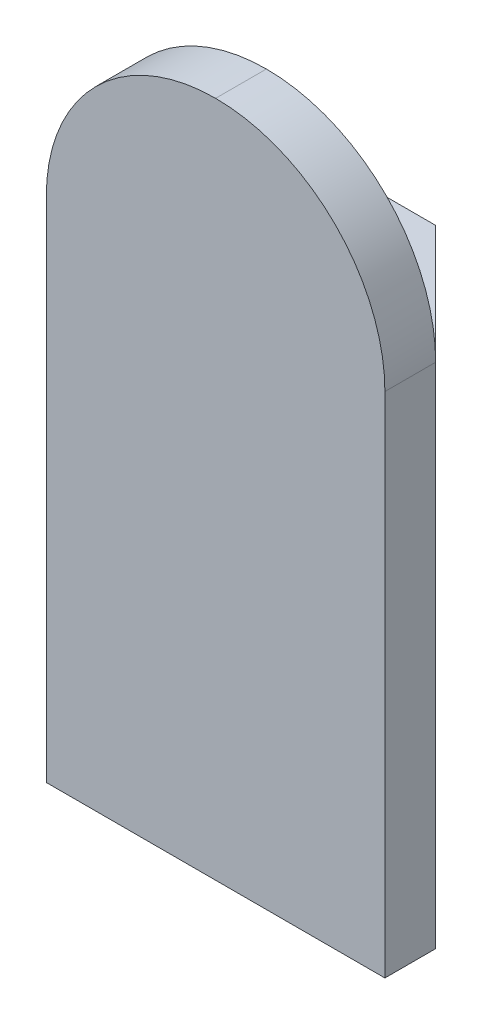
ISO-10303-21;
HEADER;
FILE_DESCRIPTION(('STEP AP214'),'2;1');
FILE_NAME('part.step','',(''),(''),'','','');
FILE_SCHEMA(('AUTOMOTIVE_DESIGN { 1 0 10303 214 1 1 1 1 }'));
ENDSEC;
DATA;
#1=APPLICATION_CONTEXT('core data for automotive mechanical design processes');
#2=APPLICATION_PROTOCOL_DEFINITION('international standard','automotive_design',2000,#1);
#3=PRODUCT_CONTEXT('',#1,'mechanical');
#4=PRODUCT('Part','Part','',(#3));
#5=PRODUCT_RELATED_PRODUCT_CATEGORY('part','',(#4));
#6=PRODUCT_DEFINITION_FORMATION('','',#4);
#7=PRODUCT_DEFINITION_CONTEXT('part definition',#1,'design');
#8=PRODUCT_DEFINITION('design','',#6,#7);
#9=PRODUCT_DEFINITION_SHAPE('','',#8);
#10=(LENGTH_UNIT() NAMED_UNIT(*) SI_UNIT(.MILLI.,.METRE.));
#11=(NAMED_UNIT(*) PLANE_ANGLE_UNIT() SI_UNIT($,.RADIAN.));
#12=(NAMED_UNIT(*) SI_UNIT($,.STERADIAN.) SOLID_ANGLE_UNIT());
#13=UNCERTAINTY_MEASURE_WITH_UNIT(LENGTH_MEASURE(1.E-05),#10,'distance_accuracy_value','');
#14=(GEOMETRIC_REPRESENTATION_CONTEXT(3) GLOBAL_UNCERTAINTY_ASSIGNED_CONTEXT((#13)) GLOBAL_UNIT_ASSIGNED_CONTEXT((#10,
#11,#12)) REPRESENTATION_CONTEXT('',''));
#15=CARTESIAN_POINT('',(0.,0.,0.));
#16=DIRECTION('',(0.,0.,1.));
#17=DIRECTION('',(1.,0.,0.));
#18=AXIS2_PLACEMENT_3D('',#15,#16,#17);
#19=CARTESIAN_POINT('',(0.,10.,0.));
#20=DIRECTION('',(0.,0.,1.));
#21=DIRECTION('',(1.,0.,0.));
#22=AXIS2_PLACEMENT_3D('',#19,#20,#21);
#23=PLANE('',#22);
#24=CARTESIAN_POINT('',(10.,20.,0.));
#25=DIRECTION('',(0.,0.,1.));
#26=DIRECTION('',(1.,0.,0.));
#27=AXIS2_PLACEMENT_3D('',#24,#25,#26);
#28=CIRCLE('',#27,10.);
#29=CARTESIAN_POINT('',(20.,20.,0.));
#30=VERTEX_POINT('',#29);
#31=CARTESIAN_POINT('',(10.,30.,0.));
#32=VERTEX_POINT('',#31);
#33=EDGE_CURVE('E194',#30,#32,#28,.T.);
#34=ORIENTED_EDGE('',*,*,#33,.T.);
#35=CARTESIAN_POINT('',(10.,20.,0.));
#36=DIRECTION('',(0.,0.,1.));
#37=DIRECTION('',(1.,0.,0.));
#38=AXIS2_PLACEMENT_3D('',#35,#36,#37);
#39=CIRCLE('',#38,10.);
#40=CARTESIAN_POINT('',(0.,20.,0.));
#41=VERTEX_POINT('',#40);
#42=EDGE_CURVE('E196',#32,#41,#39,.T.);
#43=ORIENTED_EDGE('',*,*,#42,.T.);
#44=DIRECTION('',(0.,-1.,0.));
#45=VECTOR('',#44,1.);
#46=CARTESIAN_POINT('',(0.,10.,0.));
#47=LINE('',#46,#45);
#48=CARTESIAN_POINT('',(0.,-10.,0.));
#49=VERTEX_POINT('',#48);
#50=EDGE_CURVE('E132',#41,#49,#47,.T.);
#51=ORIENTED_EDGE('',*,*,#50,.T.);
#52=DIRECTION('',(-1.,0.,0.));
#53=VECTOR('',#52,1.);
#54=CARTESIAN_POINT('',(0.,-10.,0.));
#55=LINE('',#54,#53);
#56=CARTESIAN_POINT('',(20.,-10.,0.));
#57=VERTEX_POINT('',#56);
#58=EDGE_CURVE('E166',#57,#49,#55,.T.);
#59=ORIENTED_EDGE('',*,*,#58,.F.);
#60=DIRECTION('',(0.,-1.,0.));
#61=VECTOR('',#60,1.);
#62=CARTESIAN_POINT('',(20.,10.,0.));
#63=LINE('',#62,#61);
#64=EDGE_CURVE('E192',#30,#57,#63,.T.);
#65=ORIENTED_EDGE('',*,*,#64,.F.);
#66=EDGE_LOOP('',(#34,#43,#51,#59,#65));
#67=FACE_BOUND('',#66,.T.);
#68=ADVANCED_FACE('F37',(#67),#23,.T.);
#69=CARTESIAN_POINT('',(20.,10.,0.));
#70=DIRECTION('',(1.,0.,0.));
#71=DIRECTION('',(0.,0.,-1.));
#72=AXIS2_PLACEMENT_3D('',#69,#70,#71);
#73=PLANE('',#72);
#74=DIRECTION('',(0.,-1.,0.));
#75=VECTOR('',#74,1.);
#76=CARTESIAN_POINT('',(20.,30.,-3.));
#77=LINE('',#76,#75);
#78=CARTESIAN_POINT('',(20.,20.,-3.));
#79=VERTEX_POINT('',#78);
#80=CARTESIAN_POINT('',(20.,10.,-3.));
#81=VERTEX_POINT('',#80);
#82=EDGE_CURVE('E122',#79,#81,#77,.T.);
#83=ORIENTED_EDGE('',*,*,#82,.F.);
#84=DIRECTION('',(0.,0.,-1.));
#85=VECTOR('',#84,1.);
#86=CARTESIAN_POINT('',(20.,20.,0.));
#87=LINE('',#86,#85);
#88=EDGE_CURVE('E11',#79,#30,#87,.F.);
#89=ORIENTED_EDGE('',*,*,#88,.T.);
#90=ORIENTED_EDGE('',*,*,#64,.T.);
#91=DIRECTION('',(0.,0.,1.));
#92=VECTOR('',#91,1.);
#93=CARTESIAN_POINT('',(20.,-10.,0.));
#94=LINE('',#93,#92);
#95=CARTESIAN_POINT('',(20.,-10.,-3.));
#96=VERTEX_POINT('',#95);
#97=EDGE_CURVE('E171',#96,#57,#94,.T.);
#98=ORIENTED_EDGE('',*,*,#97,.F.);
#99=DIRECTION('',(0.,-1.,0.));
#100=VECTOR('',#99,1.);
#101=CARTESIAN_POINT('',(20.,-7.,-3.));
#102=LINE('',#101,#100);
#103=CARTESIAN_POINT('',(20.,-7.,-3.));
#104=VERTEX_POINT('',#103);
#105=EDGE_CURVE('E159',#104,#96,#102,.T.);
#106=ORIENTED_EDGE('',*,*,#105,.F.);
#107=DIRECTION('',(0.,-1.,0.));
#108=VECTOR('',#107,1.);
#109=CARTESIAN_POINT('',(20.,10.,-3.));
#110=LINE('',#109,#108);
#111=CARTESIAN_POINT('',(20.,7.,-3.));
#112=VERTEX_POINT('',#111);
#113=EDGE_CURVE('E188',#112,#104,#110,.T.);
#114=ORIENTED_EDGE('',*,*,#113,.F.);
#115=EDGE_CURVE('E189',#81,#112,#110,.T.);
#116=ORIENTED_EDGE('',*,*,#115,.F.);
#117=EDGE_LOOP('',(#83,#89,#90,#98,#106,#114,#116));
#118=FACE_BOUND('',#117,.T.);
#119=ADVANCED_FACE('F212',(#118),#73,.T.);
#120=CARTESIAN_POINT('',(0.,10.,-3.));
#121=DIRECTION('',(0.,0.,-1.));
#122=DIRECTION('',(-1.,0.,0.));
#123=AXIS2_PLACEMENT_3D('',#120,#121,#122);
#124=PLANE('',#123);
#125=DIRECTION('',(1.,0.,0.));
#126=VECTOR('',#125,1.);
#127=CARTESIAN_POINT('',(0.,7.,-3.));
#128=LINE('',#127,#126);
#129=CARTESIAN_POINT('',(2.99999999999999,7.,-3.));
#130=VERTEX_POINT('',#129);
#131=EDGE_CURVE('E143',#130,#112,#128,.T.);
#132=ORIENTED_EDGE('',*,*,#131,.T.);
#133=ORIENTED_EDGE('',*,*,#113,.T.);
#134=DIRECTION('',(1.,0.,0.));
#135=VECTOR('',#134,1.);
#136=CARTESIAN_POINT('',(0.,-7.,-3.));
#137=LINE('',#136,#135);
#138=CARTESIAN_POINT('',(2.99999999999999,-7.,-3.));
#139=VERTEX_POINT('',#138);
#140=EDGE_CURVE('E156',#139,#104,#137,.T.);
#141=ORIENTED_EDGE('',*,*,#140,.F.);
#142=DIRECTION('',(0.,-1.,0.));
#143=VECTOR('',#142,1.);
#144=CARTESIAN_POINT('',(2.99999999999999,10.,-3.));
#145=LINE('',#144,#143);
#146=EDGE_CURVE('E186',#130,#139,#145,.T.);
#147=ORIENTED_EDGE('',*,*,#146,.F.);
#148=EDGE_LOOP('',(#132,#133,#141,#147));
#149=FACE_BOUND('',#148,.T.);
#150=ADVANCED_FACE('F232',(#149),#124,.T.);
#151=CARTESIAN_POINT('',(2.99999999999999,10.,0.));
#152=DIRECTION('',(1.,0.,0.));
#153=DIRECTION('',(0.,0.,-1.));
#154=AXIS2_PLACEMENT_3D('',#151,#152,#153);
#155=PLANE('',#154);
#156=DIRECTION('',(0.,0.,1.));
#157=VECTOR('',#156,1.);
#158=CARTESIAN_POINT('',(2.99999999999999,7.,0.));
#159=LINE('',#158,#157);
#160=CARTESIAN_POINT('',(2.99999999999999,7.,-20.));
#161=VERTEX_POINT('',#160);
#162=EDGE_CURVE('E145',#161,#130,#159,.T.);
#163=ORIENTED_EDGE('',*,*,#162,.T.);
#164=ORIENTED_EDGE('',*,*,#146,.T.);
#165=DIRECTION('',(0.,0.,1.));
#166=VECTOR('',#165,1.);
#167=CARTESIAN_POINT('',(2.99999999999999,-7.,0.));
#168=LINE('',#167,#166);
#169=CARTESIAN_POINT('',(2.99999999999999,-7.,-20.));
#170=VERTEX_POINT('',#169);
#171=EDGE_CURVE('E153',#170,#139,#168,.T.);
#172=ORIENTED_EDGE('',*,*,#171,.F.);
#173=DIRECTION('',(0.,-1.,0.));
#174=VECTOR('',#173,1.);
#175=CARTESIAN_POINT('',(2.99999999999999,10.,-20.));
#176=LINE('',#175,#174);
#177=EDGE_CURVE('E182',#161,#170,#176,.T.);
#178=ORIENTED_EDGE('',*,*,#177,.F.);
#179=EDGE_LOOP('',(#163,#164,#172,#178));
#180=FACE_BOUND('',#179,.T.);
#181=ADVANCED_FACE('F227',(#180),#155,.T.);
#182=CARTESIAN_POINT('',(0.,10.,-20.));
#183=DIRECTION('',(0.,0.,-1.));
#184=DIRECTION('',(-1.,0.,0.));
#185=AXIS2_PLACEMENT_3D('',#182,#183,#184);
#186=PLANE('',#185);
#187=DIRECTION('',(1.,0.,0.));
#188=VECTOR('',#187,1.);
#189=CARTESIAN_POINT('',(0.,-10.,-20.));
#190=LINE('',#189,#188);
#191=CARTESIAN_POINT('',(0.,-10.,-20.));
#192=VERTEX_POINT('',#191);
#193=CARTESIAN_POINT('',(2.99999999999999,-10.,-20.));
#194=VERTEX_POINT('',#193);
#195=EDGE_CURVE('E174',#192,#194,#190,.T.);
#196=ORIENTED_EDGE('',*,*,#195,.F.);
#197=DIRECTION('',(0.,-1.,0.));
#198=VECTOR('',#197,1.);
#199=CARTESIAN_POINT('',(0.,10.,-20.));
#200=LINE('',#199,#198);
#201=CARTESIAN_POINT('',(0.,10.,-20.));
#202=VERTEX_POINT('',#201);
#203=EDGE_CURVE('E180',#202,#192,#200,.T.);
#204=ORIENTED_EDGE('',*,*,#203,.F.);
#205=DIRECTION('',(1.,0.,0.));
#206=VECTOR('',#205,1.);
#207=CARTESIAN_POINT('',(0.,10.,-20.));
#208=LINE('',#207,#206);
#209=CARTESIAN_POINT('',(2.99999999999999,10.,-20.));
#210=VERTEX_POINT('',#209);
#211=EDGE_CURVE('E131',#202,#210,#208,.T.);
#212=ORIENTED_EDGE('',*,*,#211,.T.);
#213=EDGE_CURVE('E183',#210,#161,#176,.T.);
#214=ORIENTED_EDGE('',*,*,#213,.T.);
#215=ORIENTED_EDGE('',*,*,#177,.T.);
#216=DIRECTION('',(0.,-1.,0.));
#217=VECTOR('',#216,1.);
#218=CARTESIAN_POINT('',(2.99999999999999,-7.,-20.));
#219=LINE('',#218,#217);
#220=EDGE_CURVE('E163',#170,#194,#219,.T.);
#221=ORIENTED_EDGE('',*,*,#220,.T.);
#222=EDGE_LOOP('',(#196,#204,#212,#214,#215,#221));
#223=FACE_BOUND('',#222,.T.);
#224=ADVANCED_FACE('F241',(#223),#186,.T.);
#225=CARTESIAN_POINT('',(0.,10.,0.));
#226=DIRECTION('',(-1.,0.,0.));
#227=DIRECTION('',(0.,0.,1.));
#228=AXIS2_PLACEMENT_3D('',#225,#226,#227);
#229=PLANE('',#228);
#230=ORIENTED_EDGE('',*,*,#50,.F.);
#231=DIRECTION('',(0.,0.,1.));
#232=VECTOR('',#231,1.);
#233=CARTESIAN_POINT('',(0.,20.,-3.));
#234=LINE('',#233,#232);
#235=CARTESIAN_POINT('',(0.,20.,-3.));
#236=VERTEX_POINT('',#235);
#237=EDGE_CURVE('E120',#41,#236,#234,.F.);
#238=ORIENTED_EDGE('',*,*,#237,.T.);
#239=DIRECTION('',(0.,-1.,0.));
#240=VECTOR('',#239,1.);
#241=CARTESIAN_POINT('',(0.,30.,-3.));
#242=LINE('',#241,#240);
#243=CARTESIAN_POINT('',(0.,10.,-3.));
#244=VERTEX_POINT('',#243);
#245=EDGE_CURVE('E113',#236,#244,#242,.T.);
#246=ORIENTED_EDGE('',*,*,#245,.T.);
#247=DIRECTION('',(0.,0.,-1.));
#248=VECTOR('',#247,1.);
#249=CARTESIAN_POINT('',(0.,10.,0.));
#250=LINE('',#249,#248);
#251=EDGE_CURVE('E117',#244,#202,#250,.T.);
#252=ORIENTED_EDGE('',*,*,#251,.T.);
#253=ORIENTED_EDGE('',*,*,#203,.T.);
#254=DIRECTION('',(0.,0.,-1.));
#255=VECTOR('',#254,1.);
#256=CARTESIAN_POINT('',(0.,-10.,0.));
#257=LINE('',#256,#255);
#258=EDGE_CURVE('E167',#49,#192,#257,.T.);
#259=ORIENTED_EDGE('',*,*,#258,.F.);
#260=EDGE_LOOP('',(#230,#238,#246,#252,#253,#259));
#261=FACE_BOUND('',#260,.T.);
#262=ADVANCED_FACE('F116',(#261),#229,.T.);
#263=CARTESIAN_POINT('',(0.,10.,0.));
#264=DIRECTION('',(0.,1.,0.));
#265=DIRECTION('',(0.,0.,1.));
#266=AXIS2_PLACEMENT_3D('',#263,#264,#265);
#267=PLANE('',#266);
#268=DIRECTION('',(-1.,0.,0.));
#269=VECTOR('',#268,1.);
#270=CARTESIAN_POINT('',(0.,10.,-3.));
#271=LINE('',#270,#269);
#272=EDGE_CURVE('E123',#81,#244,#271,.T.);
#273=ORIENTED_EDGE('',*,*,#272,.F.);
#274=DIRECTION('',(0.707106781186548,0.,0.707106781186547));
#275=VECTOR('',#274,1.);
#276=CARTESIAN_POINT('',(11.5,10.,-11.5));
#277=LINE('',#276,#275);
#278=EDGE_CURVE('E139',#210,#81,#277,.T.);
#279=ORIENTED_EDGE('',*,*,#278,.F.);
#280=ORIENTED_EDGE('',*,*,#211,.F.);
#281=ORIENTED_EDGE('',*,*,#251,.F.);
#282=EDGE_LOOP('',(#273,#279,#280,#281));
#283=FACE_BOUND('',#282,.T.);
#284=ADVANCED_FACE('F128',(#283),#267,.T.);
#285=CARTESIAN_POINT('',(0.,-10.,0.));
#286=DIRECTION('',(0.,1.,0.));
#287=DIRECTION('',(0.,0.,1.));
#288=AXIS2_PLACEMENT_3D('',#285,#286,#287);
#289=PLANE('',#288);
#290=ORIENTED_EDGE('',*,*,#58,.T.);
#291=ORIENTED_EDGE('',*,*,#258,.T.);
#292=ORIENTED_EDGE('',*,*,#195,.T.);
#293=DIRECTION('',(0.707106781186548,0.,0.707106781186547));
#294=VECTOR('',#293,1.);
#295=CARTESIAN_POINT('',(11.5,-10.,-11.5));
#296=LINE('',#295,#294);
#297=EDGE_CURVE('E147',#194,#96,#296,.T.);
#298=ORIENTED_EDGE('',*,*,#297,.T.);
#299=ORIENTED_EDGE('',*,*,#97,.T.);
#300=EDGE_LOOP('',(#290,#291,#292,#298,#299));
#301=FACE_BOUND('',#300,.T.);
#302=ADVANCED_FACE('F215',(#301),#289,.F.);
#303=CARTESIAN_POINT('',(11.5,-7.,-11.5));
#304=DIRECTION('',(0.707106781186547,0.,-0.707106781186548));
#305=DIRECTION('',(-0.707106781186548,0.,-0.707106781186547));
#306=AXIS2_PLACEMENT_3D('',#303,#304,#305);
#307=PLANE('',#306);
#308=ORIENTED_EDGE('',*,*,#297,.F.);
#309=ORIENTED_EDGE('',*,*,#220,.F.);
#310=DIRECTION('',(0.707106781186548,0.,0.707106781186547));
#311=VECTOR('',#310,1.);
#312=CARTESIAN_POINT('',(11.5,-7.,-11.5));
#313=LINE('',#312,#311);
#314=EDGE_CURVE('E150',#170,#104,#313,.T.);
#315=ORIENTED_EDGE('',*,*,#314,.T.);
#316=ORIENTED_EDGE('',*,*,#105,.T.);
#317=EDGE_LOOP('',(#308,#309,#315,#316));
#318=FACE_BOUND('',#317,.T.);
#319=ADVANCED_FACE('F219',(#318),#307,.T.);
#320=CARTESIAN_POINT('',(0.,-7.,0.));
#321=DIRECTION('',(0.,1.,0.));
#322=DIRECTION('',(0.,0.,1.));
#323=AXIS2_PLACEMENT_3D('',#320,#321,#322);
#324=PLANE('',#323);
#325=ORIENTED_EDGE('',*,*,#314,.F.);
#326=ORIENTED_EDGE('',*,*,#171,.T.);
#327=ORIENTED_EDGE('',*,*,#140,.T.);
#328=EDGE_LOOP('',(#325,#326,#327));
#329=FACE_BOUND('',#328,.T.);
#330=ADVANCED_FACE('F224',(#329),#324,.T.);
#331=CARTESIAN_POINT('',(11.5,7.,-11.5));
#332=DIRECTION('',(-0.707106781186547,0.,0.707106781186548));
#333=DIRECTION('',(0.707106781186548,0.,0.707106781186547));
#334=AXIS2_PLACEMENT_3D('',#331,#332,#333);
#335=PLANE('',#334);
#336=ORIENTED_EDGE('',*,*,#278,.T.);
#337=ORIENTED_EDGE('',*,*,#115,.T.);
#338=DIRECTION('',(0.707106781186548,0.,0.707106781186547));
#339=VECTOR('',#338,1.);
#340=CARTESIAN_POINT('',(11.5,7.,-11.5));
#341=LINE('',#340,#339);
#342=EDGE_CURVE('E140',#161,#112,#341,.T.);
#343=ORIENTED_EDGE('',*,*,#342,.F.);
#344=ORIENTED_EDGE('',*,*,#213,.F.);
#345=EDGE_LOOP('',(#336,#337,#343,#344));
#346=FACE_BOUND('',#345,.T.);
#347=ADVANCED_FACE('F238',(#346),#335,.F.);
#348=CARTESIAN_POINT('',(0.,7.,0.));
#349=DIRECTION('',(0.,-1.,0.));
#350=DIRECTION('',(0.,0.,1.));
#351=AXIS2_PLACEMENT_3D('',#348,#349,#350);
#352=PLANE('',#351);
#353=ORIENTED_EDGE('',*,*,#342,.T.);
#354=ORIENTED_EDGE('',*,*,#131,.F.);
#355=ORIENTED_EDGE('',*,*,#162,.F.);
#356=EDGE_LOOP('',(#353,#354,#355));
#357=FACE_BOUND('',#356,.T.);
#358=ADVANCED_FACE('F234',(#357),#352,.T.);
#359=CARTESIAN_POINT('',(0.,30.,-3.));
#360=DIRECTION('',(0.,0.,1.));
#361=DIRECTION('',(1.,0.,0.));
#362=AXIS2_PLACEMENT_3D('',#359,#360,#361);
#363=PLANE('',#362);
#364=ORIENTED_EDGE('',*,*,#245,.F.);
#365=CARTESIAN_POINT('',(10.,20.,-3.));
#366=DIRECTION('',(0.,0.,1.));
#367=DIRECTION('',(1.,0.,0.));
#368=AXIS2_PLACEMENT_3D('',#365,#366,#367);
#369=CIRCLE('',#368,10.);
#370=CARTESIAN_POINT('',(10.,30.,-3.));
#371=VERTEX_POINT('',#370);
#372=EDGE_CURVE('E46',#236,#371,#369,.F.);
#373=ORIENTED_EDGE('',*,*,#372,.T.);
#374=CARTESIAN_POINT('',(10.,20.,-3.));
#375=DIRECTION('',(0.,0.,1.));
#376=DIRECTION('',(1.,0.,0.));
#377=AXIS2_PLACEMENT_3D('',#374,#375,#376);
#378=CIRCLE('',#377,10.);
#379=EDGE_CURVE('E53',#371,#79,#378,.F.);
#380=ORIENTED_EDGE('',*,*,#379,.T.);
#381=ORIENTED_EDGE('',*,*,#82,.T.);
#382=ORIENTED_EDGE('',*,*,#272,.T.);
#383=EDGE_LOOP('',(#364,#373,#380,#381,#382));
#384=FACE_BOUND('',#383,.T.);
#385=ADVANCED_FACE('F134',(#384),#363,.F.);
#386=CARTESIAN_POINT('',(10.,20.,0.));
#387=DIRECTION('',(0.,0.,1.));
#388=DIRECTION('',(1.,0.,0.));
#389=AXIS2_PLACEMENT_3D('',#386,#387,#388);
#390=CYLINDRICAL_SURFACE('',#389,10.);
#391=ORIENTED_EDGE('',*,*,#88,.F.);
#392=ORIENTED_EDGE('',*,*,#379,.F.);
#393=DIRECTION('',(0.,0.,-1.));
#394=VECTOR('',#393,1.);
#395=CARTESIAN_POINT('',(10.,30.,-2.99999999999999));
#396=LINE('',#395,#394);
#397=EDGE_CURVE('E41',#32,#371,#396,.T.);
#398=ORIENTED_EDGE('',*,*,#397,.F.);
#399=ORIENTED_EDGE('',*,*,#33,.F.);
#400=EDGE_LOOP('',(#391,#392,#398,#399));
#401=FACE_BOUND('',#400,.T.);
#402=ADVANCED_FACE('F39',(#401),#390,.T.);
#403=CARTESIAN_POINT('',(10.,20.,0.));
#404=DIRECTION('',(0.,0.,-1.));
#405=DIRECTION('',(-1.,0.,0.));
#406=AXIS2_PLACEMENT_3D('',#403,#404,#405);
#407=CYLINDRICAL_SURFACE('',#406,10.);
#408=ORIENTED_EDGE('',*,*,#372,.F.);
#409=ORIENTED_EDGE('',*,*,#237,.F.);
#410=ORIENTED_EDGE('',*,*,#42,.F.);
#411=ORIENTED_EDGE('',*,*,#397,.T.);
#412=EDGE_LOOP('',(#408,#409,#410,#411));
#413=FACE_BOUND('',#412,.T.);
#414=ADVANCED_FACE('F208',(#413),#407,.T.);
#415=CLOSED_SHELL('',(#68,#119,#150,#181,#224,#262,#284,#302,#319,#330,#347,#358,#385,#402,#414));
#416=MANIFOLD_SOLID_BREP('B2',#415);
#417=ADVANCED_BREP_SHAPE_REPRESENTATION('',(#18,#416),#14);
#418=SHAPE_DEFINITION_REPRESENTATION(#9,#417);
ENDSEC;
END-ISO-10303-21;
